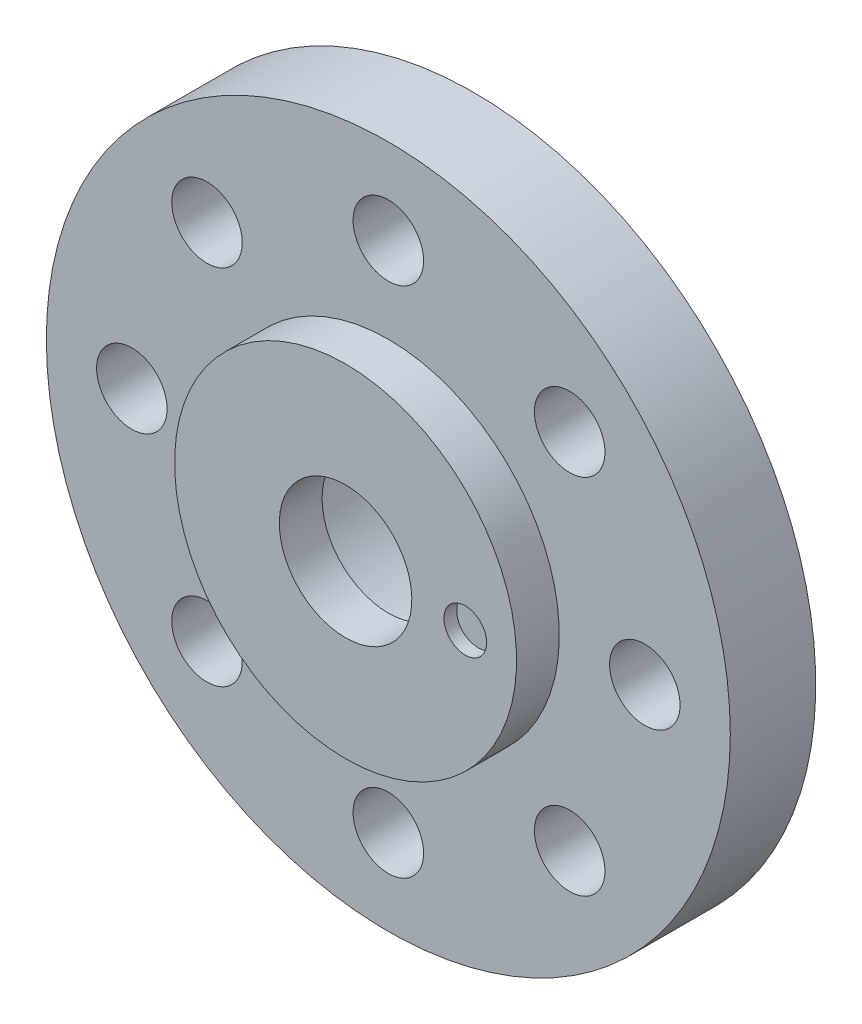
ISO-10303-21;
HEADER;
FILE_DESCRIPTION(('STEP AP214'),'2;1');
FILE_NAME('part.step','',(''),(''),'','','');
FILE_SCHEMA(('AUTOMOTIVE_DESIGN { 1 0 10303 214 1 1 1 1 }'));
ENDSEC;
DATA;
#1=APPLICATION_CONTEXT('core data for automotive mechanical design processes');
#2=APPLICATION_PROTOCOL_DEFINITION('international standard','automotive_design',2000,#1);
#3=PRODUCT_CONTEXT('',#1,'mechanical');
#4=PRODUCT('Part','Part','',(#3));
#5=PRODUCT_RELATED_PRODUCT_CATEGORY('part','',(#4));
#6=PRODUCT_DEFINITION_FORMATION('','',#4);
#7=PRODUCT_DEFINITION_CONTEXT('part definition',#1,'design');
#8=PRODUCT_DEFINITION('design','',#6,#7);
#9=PRODUCT_DEFINITION_SHAPE('','',#8);
#10=(LENGTH_UNIT() NAMED_UNIT(*) SI_UNIT(.MILLI.,.METRE.));
#11=(NAMED_UNIT(*) PLANE_ANGLE_UNIT() SI_UNIT($,.RADIAN.));
#12=(NAMED_UNIT(*) SI_UNIT($,.STERADIAN.) SOLID_ANGLE_UNIT());
#13=UNCERTAINTY_MEASURE_WITH_UNIT(LENGTH_MEASURE(1.E-05),#10,'distance_accuracy_value','');
#14=(GEOMETRIC_REPRESENTATION_CONTEXT(3) GLOBAL_UNCERTAINTY_ASSIGNED_CONTEXT((#13)) GLOBAL_UNIT_ASSIGNED_CONTEXT((#10,
#11,#12)) REPRESENTATION_CONTEXT('',''));
#15=CARTESIAN_POINT('',(0.,0.,0.));
#16=DIRECTION('',(0.,0.,1.));
#17=DIRECTION('',(1.,0.,0.));
#18=AXIS2_PLACEMENT_3D('',#15,#16,#17);
#19=CARTESIAN_POINT('',(2.175,-0.625,10.7));
#20=DIRECTION('',(0.,0.,1.));
#21=DIRECTION('',(1.,0.,0.));
#22=AXIS2_PLACEMENT_3D('',#19,#20,#21);
#23=PLANE('',#22);
#24=CARTESIAN_POINT('',(2.8,0.,10.7));
#25=DIRECTION('',(0.,0.,1.));
#26=DIRECTION('',(1.,0.,0.));
#27=AXIS2_PLACEMENT_3D('',#24,#25,#26);
#28=CIRCLE('',#27,0.5);
#29=CARTESIAN_POINT('',(3.3,0.,10.7));
#30=VERTEX_POINT('',#29);
#31=EDGE_CURVE('E10',#30,#30,#28,.T.);
#32=ORIENTED_EDGE('',*,*,#31,.T.);
#33=EDGE_LOOP('',(#32));
#34=FACE_BOUND('',#33,.T.);
#35=ADVANCED_FACE('F16',(#34),#23,.T.);
#36=CARTESIAN_POINT('',(2.8,0.,10.82));
#37=DIRECTION('',(0.,0.,1.));
#38=DIRECTION('',(1.,0.,0.));
#39=AXIS2_PLACEMENT_3D('',#36,#37,#38);
#40=CYLINDRICAL_SURFACE('',#39,0.5);
#41=ORIENTED_EDGE('',*,*,#31,.F.);
#42=EDGE_LOOP('',(#41));
#43=FACE_BOUND('',#42,.T.);
#44=CARTESIAN_POINT('',(2.8,0.,11.));
#45=DIRECTION('',(0.,0.,-1.));
#46=DIRECTION('',(1.,0.,0.));
#47=AXIS2_PLACEMENT_3D('',#44,#45,#46);
#48=CIRCLE('',#47,0.5);
#49=CARTESIAN_POINT('',(3.3,0.,11.));
#50=VERTEX_POINT('',#49);
#51=EDGE_CURVE('E168',#50,#50,#48,.T.);
#52=ORIENTED_EDGE('',*,*,#51,.F.);
#53=EDGE_LOOP('',(#52));
#54=FACE_BOUND('',#53,.T.);
#55=ADVANCED_FACE('F244',(#43,#54),#40,.F.);
#56=CARTESIAN_POINT('',(0.,0.,7.04));
#57=DIRECTION('',(0.,0.,1.));
#58=DIRECTION('',(1.,0.,0.));
#59=AXIS2_PLACEMENT_3D('',#56,#57,#58);
#60=CYLINDRICAL_SURFACE('',#59,4.5);
#61=CARTESIAN_POINT('',(0.,0.,6.8));
#62=DIRECTION('',(0.,0.,1.));
#63=DIRECTION('',(1.,0.,0.));
#64=AXIS2_PLACEMENT_3D('',#61,#62,#63);
#65=CIRCLE('',#64,4.5);
#66=CARTESIAN_POINT('',(4.5,0.,6.8));
#67=VERTEX_POINT('',#66);
#68=EDGE_CURVE('E199',#67,#67,#65,.T.);
#69=ORIENTED_EDGE('',*,*,#68,.T.);
#70=EDGE_LOOP('',(#69));
#71=FACE_BOUND('',#70,.T.);
#72=CARTESIAN_POINT('',(0.,0.,8.));
#73=DIRECTION('',(0.,0.,-1.));
#74=DIRECTION('',(-1.,0.,0.));
#75=AXIS2_PLACEMENT_3D('',#72,#73,#74);
#76=CIRCLE('',#75,4.5);
#77=CARTESIAN_POINT('',(-4.5,0.,8.));
#78=VERTEX_POINT('',#77);
#79=EDGE_CURVE('E26',#78,#78,#76,.T.);
#80=ORIENTED_EDGE('',*,*,#79,.T.);
#81=EDGE_LOOP('',(#80));
#82=FACE_BOUND('',#81,.T.);
#83=ADVANCED_FACE('F249',(#71,#82),#60,.T.);
#84=CARTESIAN_POINT('',(-11.2051849924017,10.026423563649,8.));
#85=DIRECTION('',(0.,0.,-1.));
#86=DIRECTION('',(0.,-1.,0.));
#87=AXIS2_PLACEMENT_3D('',#84,#85,#86);
#88=PLANE('',#87);
#89=ORIENTED_EDGE('',*,*,#79,.F.);
#90=EDGE_LOOP('',(#89));
#91=FACE_BOUND('',#90,.T.);
#92=CARTESIAN_POINT('',(0.,-6.,8.));
#93=DIRECTION('',(0.,0.,1.));
#94=DIRECTION('',(0.,1.,0.));
#95=AXIS2_PLACEMENT_3D('',#92,#93,#94);
#96=CIRCLE('',#95,0.825);
#97=CARTESIAN_POINT('',(0.,-5.175,8.));
#98=VERTEX_POINT('',#97);
#99=EDGE_CURVE('E195',#98,#98,#96,.T.);
#100=ORIENTED_EDGE('',*,*,#99,.T.);
#101=EDGE_LOOP('',(#100));
#102=FACE_BOUND('',#101,.T.);
#103=CARTESIAN_POINT('',(4.24264068711929,-4.24264068711928,8.));
#104=DIRECTION('',(0.,0.,1.));
#105=DIRECTION('',(0.,1.,0.));
#106=AXIS2_PLACEMENT_3D('',#103,#104,#105);
#107=CIRCLE('',#106,0.825);
#108=CARTESIAN_POINT('',(4.24264068711929,-3.41764068711928,8.));
#109=VERTEX_POINT('',#108);
#110=EDGE_CURVE('E192',#109,#109,#107,.T.);
#111=ORIENTED_EDGE('',*,*,#110,.T.);
#112=EDGE_LOOP('',(#111));
#113=FACE_BOUND('',#112,.T.);
#114=CARTESIAN_POINT('',(6.,0.,8.));
#115=DIRECTION('',(0.,0.,1.));
#116=DIRECTION('',(0.,1.,0.));
#117=AXIS2_PLACEMENT_3D('',#114,#115,#116);
#118=CIRCLE('',#117,0.825);
#119=CARTESIAN_POINT('',(6.,0.825000000000021,8.));
#120=VERTEX_POINT('',#119);
#121=EDGE_CURVE('E196',#120,#120,#118,.T.);
#122=ORIENTED_EDGE('',*,*,#121,.T.);
#123=EDGE_LOOP('',(#122));
#124=FACE_BOUND('',#123,.T.);
#125=CARTESIAN_POINT('',(4.24264068711926,4.24264068711931,8.));
#126=DIRECTION('',(0.,0.,1.));
#127=DIRECTION('',(0.,1.,0.));
#128=AXIS2_PLACEMENT_3D('',#125,#126,#127);
#129=CIRCLE('',#128,0.825);
#130=CARTESIAN_POINT('',(4.24264068711926,5.06764068711931,8.));
#131=VERTEX_POINT('',#130);
#132=EDGE_CURVE('E209',#131,#131,#129,.T.);
#133=ORIENTED_EDGE('',*,*,#132,.T.);
#134=EDGE_LOOP('',(#133));
#135=FACE_BOUND('',#134,.T.);
#136=CARTESIAN_POINT('',(0.,6.,8.));
#137=DIRECTION('',(0.,0.,1.));
#138=DIRECTION('',(0.,1.,0.));
#139=AXIS2_PLACEMENT_3D('',#136,#137,#138);
#140=CIRCLE('',#139,0.825);
#141=CARTESIAN_POINT('',(0.,6.825,8.));
#142=VERTEX_POINT('',#141);
#143=EDGE_CURVE('E160',#142,#142,#140,.T.);
#144=ORIENTED_EDGE('',*,*,#143,.T.);
#145=EDGE_LOOP('',(#144));
#146=FACE_BOUND('',#145,.T.);
#147=CARTESIAN_POINT('',(-4.24264068711931,4.24264068711925,8.));
#148=DIRECTION('',(0.,0.,1.));
#149=DIRECTION('',(0.,1.,0.));
#150=AXIS2_PLACEMENT_3D('',#147,#148,#149);
#151=CIRCLE('',#150,0.825);
#152=CARTESIAN_POINT('',(-4.24264068711932,5.06764068711925,8.));
#153=VERTEX_POINT('',#152);
#154=EDGE_CURVE('E152',#153,#153,#151,.T.);
#155=ORIENTED_EDGE('',*,*,#154,.T.);
#156=EDGE_LOOP('',(#155));
#157=FACE_BOUND('',#156,.T.);
#158=CARTESIAN_POINT('',(-6.,0.,8.));
#159=DIRECTION('',(0.,0.,1.));
#160=DIRECTION('',(0.,1.,0.));
#161=AXIS2_PLACEMENT_3D('',#158,#159,#160);
#162=CIRCLE('',#161,0.825);
#163=CARTESIAN_POINT('',(-6.,0.824999999999936,8.));
#164=VERTEX_POINT('',#163);
#165=EDGE_CURVE('E147',#164,#164,#162,.T.);
#166=ORIENTED_EDGE('',*,*,#165,.T.);
#167=EDGE_LOOP('',(#166));
#168=FACE_BOUND('',#167,.T.);
#169=CARTESIAN_POINT('',(-4.24264068711923,-4.24264068711934,8.));
#170=DIRECTION('',(0.,0.,1.));
#171=DIRECTION('',(0.,1.,0.));
#172=AXIS2_PLACEMENT_3D('',#169,#170,#171);
#173=CIRCLE('',#172,0.825);
#174=CARTESIAN_POINT('',(-4.24264068711923,-3.41764068711934,8.));
#175=VERTEX_POINT('',#174);
#176=EDGE_CURVE('E153',#175,#175,#173,.T.);
#177=ORIENTED_EDGE('',*,*,#176,.T.);
#178=EDGE_LOOP('',(#177));
#179=FACE_BOUND('',#178,.T.);
#180=CARTESIAN_POINT('',(2.690741E-12,8.586008E-13,8.));
#181=DIRECTION('',(0.,0.,-1.));
#182=DIRECTION('',(-0.819152044289053,-0.573576436350958,0.));
#183=AXIS2_PLACEMENT_3D('',#180,#181,#182);
#184=CIRCLE('',#183,8.00000000000269);
#185=CARTESIAN_POINT('',(-6.55321635431194,-4.58861149080835,8.));
#186=VERTEX_POINT('',#185);
#187=EDGE_CURVE('E204',#186,#186,#184,.T.);
#188=ORIENTED_EDGE('',*,*,#187,.T.);
#189=EDGE_LOOP('',(#188));
#190=FACE_BOUND('',#189,.T.);
#191=ADVANCED_FACE('F148',(#91,#102,#113,#124,#135,#146,#157,#168,#179,#190),#88,.T.);
#192=CARTESIAN_POINT('',(0.,-6.,8.28));
#193=DIRECTION('',(0.,0.,1.));
#194=DIRECTION('',(1.,0.,0.));
#195=AXIS2_PLACEMENT_3D('',#192,#193,#194);
#196=CYLINDRICAL_SURFACE('',#195,0.825);
#197=CARTESIAN_POINT('',(0.,-6.,10.));
#198=DIRECTION('',(0.,0.,-1.));
#199=DIRECTION('',(0.,-1.,0.));
#200=AXIS2_PLACEMENT_3D('',#197,#198,#199);
#201=CIRCLE('',#200,0.825);
#202=CARTESIAN_POINT('',(0.,-6.825,10.));
#203=VERTEX_POINT('',#202);
#204=EDGE_CURVE('E181',#203,#203,#201,.T.);
#205=ORIENTED_EDGE('',*,*,#204,.F.);
#206=EDGE_LOOP('',(#205));
#207=FACE_BOUND('',#206,.T.);
#208=ORIENTED_EDGE('',*,*,#99,.F.);
#209=EDGE_LOOP('',(#208));
#210=FACE_BOUND('',#209,.T.);
#211=ADVANCED_FACE('F254',(#207,#210),#196,.F.);
#212=CARTESIAN_POINT('',(4.24264068711929,-4.24264068711928,8.28));
#213=DIRECTION('',(0.,0.,1.));
#214=DIRECTION('',(1.,0.,0.));
#215=AXIS2_PLACEMENT_3D('',#212,#213,#214);
#216=CYLINDRICAL_SURFACE('',#215,0.825);
#217=CARTESIAN_POINT('',(4.24264068711927,-4.24264068711927,10.));
#218=DIRECTION('',(0.,0.,-1.));
#219=DIRECTION('',(0.,-1.,0.));
#220=AXIS2_PLACEMENT_3D('',#217,#218,#219);
#221=CIRCLE('',#220,0.825);
#222=CARTESIAN_POINT('',(4.24264068711929,-5.06764068711928,10.));
#223=VERTEX_POINT('',#222);
#224=EDGE_CURVE('E184',#223,#223,#221,.T.);
#225=ORIENTED_EDGE('',*,*,#224,.F.);
#226=EDGE_LOOP('',(#225));
#227=FACE_BOUND('',#226,.T.);
#228=ORIENTED_EDGE('',*,*,#110,.F.);
#229=EDGE_LOOP('',(#228));
#230=FACE_BOUND('',#229,.T.);
#231=ADVANCED_FACE('F287',(#227,#230),#216,.F.);
#232=CARTESIAN_POINT('',(6.,0.,8.28));
#233=DIRECTION('',(0.,0.,1.));
#234=DIRECTION('',(1.,0.,0.));
#235=AXIS2_PLACEMENT_3D('',#232,#233,#234);
#236=CYLINDRICAL_SURFACE('',#235,0.825);
#237=CARTESIAN_POINT('',(6.,0.,10.));
#238=DIRECTION('',(0.,0.,-1.));
#239=DIRECTION('',(0.,-1.,0.));
#240=AXIS2_PLACEMENT_3D('',#237,#238,#239);
#241=CIRCLE('',#240,0.825);
#242=CARTESIAN_POINT('',(6.,-0.824999999999978,10.));
#243=VERTEX_POINT('',#242);
#244=EDGE_CURVE('E187',#243,#243,#241,.T.);
#245=ORIENTED_EDGE('',*,*,#244,.F.);
#246=EDGE_LOOP('',(#245));
#247=FACE_BOUND('',#246,.T.);
#248=ORIENTED_EDGE('',*,*,#121,.F.);
#249=EDGE_LOOP('',(#248));
#250=FACE_BOUND('',#249,.T.);
#251=ADVANCED_FACE('F283',(#247,#250),#236,.F.);
#252=CARTESIAN_POINT('',(4.24264068711926,4.24264068711931,8.28));
#253=DIRECTION('',(0.,0.,1.));
#254=DIRECTION('',(1.,0.,0.));
#255=AXIS2_PLACEMENT_3D('',#252,#253,#254);
#256=CYLINDRICAL_SURFACE('',#255,0.825);
#257=CARTESIAN_POINT('',(4.24264068711924,4.24264068711931,10.));
#258=DIRECTION('',(0.,0.,-1.));
#259=DIRECTION('',(0.,-1.,0.));
#260=AXIS2_PLACEMENT_3D('',#257,#258,#259);
#261=CIRCLE('',#260,0.825);
#262=CARTESIAN_POINT('',(4.24264068711926,3.41764068711931,10.));
#263=VERTEX_POINT('',#262);
#264=EDGE_CURVE('E188',#263,#263,#261,.T.);
#265=ORIENTED_EDGE('',*,*,#264,.F.);
#266=EDGE_LOOP('',(#265));
#267=FACE_BOUND('',#266,.T.);
#268=ORIENTED_EDGE('',*,*,#132,.F.);
#269=EDGE_LOOP('',(#268));
#270=FACE_BOUND('',#269,.T.);
#271=ADVANCED_FACE('F286',(#267,#270),#256,.F.);
#272=CARTESIAN_POINT('',(0.,6.,8.28));
#273=DIRECTION('',(0.,0.,1.));
#274=DIRECTION('',(1.,0.,0.));
#275=AXIS2_PLACEMENT_3D('',#272,#273,#274);
#276=CYLINDRICAL_SURFACE('',#275,0.825);
#277=CARTESIAN_POINT('',(0.,6.,10.));
#278=DIRECTION('',(0.,0.,-1.));
#279=DIRECTION('',(0.,-1.,0.));
#280=AXIS2_PLACEMENT_3D('',#277,#278,#279);
#281=CIRCLE('',#280,0.825);
#282=CARTESIAN_POINT('',(0.,5.175,10.));
#283=VERTEX_POINT('',#282);
#284=EDGE_CURVE('E191',#283,#283,#281,.T.);
#285=ORIENTED_EDGE('',*,*,#284,.F.);
#286=EDGE_LOOP('',(#285));
#287=FACE_BOUND('',#286,.T.);
#288=ORIENTED_EDGE('',*,*,#143,.F.);
#289=EDGE_LOOP('',(#288));
#290=FACE_BOUND('',#289,.T.);
#291=ADVANCED_FACE('F281',(#287,#290),#276,.F.);
#292=CARTESIAN_POINT('',(-4.24264068711932,4.24264068711925,8.28));
#293=DIRECTION('',(0.,0.,1.));
#294=DIRECTION('',(1.,0.,0.));
#295=AXIS2_PLACEMENT_3D('',#292,#293,#294);
#296=CYLINDRICAL_SURFACE('',#295,0.825);
#297=CARTESIAN_POINT('',(-4.24264068711931,4.24264068711924,10.));
#298=DIRECTION('',(0.,0.,-1.));
#299=DIRECTION('',(0.,-1.,0.));
#300=AXIS2_PLACEMENT_3D('',#297,#298,#299);
#301=CIRCLE('',#300,0.825);
#302=CARTESIAN_POINT('',(-4.24264068711932,3.41764068711925,10.));
#303=VERTEX_POINT('',#302);
#304=EDGE_CURVE('E162',#303,#303,#301,.T.);
#305=ORIENTED_EDGE('',*,*,#304,.F.);
#306=EDGE_LOOP('',(#305));
#307=FACE_BOUND('',#306,.T.);
#308=ORIENTED_EDGE('',*,*,#154,.F.);
#309=EDGE_LOOP('',(#308));
#310=FACE_BOUND('',#309,.T.);
#311=ADVANCED_FACE('F278',(#307,#310),#296,.F.);
#312=CARTESIAN_POINT('',(-6.,0.,8.28));
#313=DIRECTION('',(0.,0.,1.));
#314=DIRECTION('',(1.,0.,0.));
#315=AXIS2_PLACEMENT_3D('',#312,#313,#314);
#316=CYLINDRICAL_SURFACE('',#315,0.825);
#317=CARTESIAN_POINT('',(-6.,0.,10.));
#318=DIRECTION('',(0.,0.,-1.));
#319=DIRECTION('',(0.,-1.,0.));
#320=AXIS2_PLACEMENT_3D('',#317,#318,#319);
#321=CIRCLE('',#320,0.825);
#322=CARTESIAN_POINT('',(-6.,-0.825000000000063,10.));
#323=VERTEX_POINT('',#322);
#324=EDGE_CURVE('E177',#323,#323,#321,.T.);
#325=ORIENTED_EDGE('',*,*,#324,.F.);
#326=EDGE_LOOP('',(#325));
#327=FACE_BOUND('',#326,.T.);
#328=ORIENTED_EDGE('',*,*,#165,.F.);
#329=EDGE_LOOP('',(#328));
#330=FACE_BOUND('',#329,.T.);
#331=ADVANCED_FACE('F237',(#327,#330),#316,.F.);
#332=CARTESIAN_POINT('',(-4.24264068711923,-4.24264068711934,8.28));
#333=DIRECTION('',(0.,0.,1.));
#334=DIRECTION('',(1.,0.,0.));
#335=AXIS2_PLACEMENT_3D('',#332,#333,#334);
#336=CYLINDRICAL_SURFACE('',#335,0.825);
#337=CARTESIAN_POINT('',(-4.24264068711921,-4.24264068711933,10.));
#338=DIRECTION('',(0.,0.,-1.));
#339=DIRECTION('',(0.,-1.,0.));
#340=AXIS2_PLACEMENT_3D('',#337,#338,#339);
#341=CIRCLE('',#340,0.825);
#342=CARTESIAN_POINT('',(-4.24264068711923,-5.06764068711934,10.));
#343=VERTEX_POINT('',#342);
#344=EDGE_CURVE('E166',#343,#343,#341,.T.);
#345=ORIENTED_EDGE('',*,*,#344,.F.);
#346=EDGE_LOOP('',(#345));
#347=FACE_BOUND('',#346,.T.);
#348=ORIENTED_EDGE('',*,*,#176,.F.);
#349=EDGE_LOOP('',(#348));
#350=FACE_BOUND('',#349,.T.);
#351=ADVANCED_FACE('F228',(#347,#350),#336,.F.);
#352=CARTESIAN_POINT('',(-8.800000000007,-8.8,10.));
#353=DIRECTION('',(0.,0.,1.));
#354=DIRECTION('',(1.,0.,0.));
#355=AXIS2_PLACEMENT_3D('',#352,#353,#354);
#356=PLANE('',#355);
#357=CARTESIAN_POINT('',(0.,0.,10.));
#358=DIRECTION('',(0.,0.,1.));
#359=DIRECTION('',(0.,-1.,0.));
#360=AXIS2_PLACEMENT_3D('',#357,#358,#359);
#361=CIRCLE('',#360,4.);
#362=CARTESIAN_POINT('',(0.,-4.,10.));
#363=VERTEX_POINT('',#362);
#364=EDGE_CURVE('E116',#363,#363,#361,.T.);
#365=ORIENTED_EDGE('',*,*,#364,.F.);
#366=EDGE_LOOP('',(#365));
#367=FACE_BOUND('',#366,.T.);
#368=ORIENTED_EDGE('',*,*,#304,.T.);
#369=EDGE_LOOP('',(#368));
#370=FACE_BOUND('',#369,.T.);
#371=ORIENTED_EDGE('',*,*,#284,.T.);
#372=EDGE_LOOP('',(#371));
#373=FACE_BOUND('',#372,.T.);
#374=ORIENTED_EDGE('',*,*,#264,.T.);
#375=EDGE_LOOP('',(#374));
#376=FACE_BOUND('',#375,.T.);
#377=ORIENTED_EDGE('',*,*,#244,.T.);
#378=EDGE_LOOP('',(#377));
#379=FACE_BOUND('',#378,.T.);
#380=ORIENTED_EDGE('',*,*,#224,.T.);
#381=EDGE_LOOP('',(#380));
#382=FACE_BOUND('',#381,.T.);
#383=ORIENTED_EDGE('',*,*,#204,.T.);
#384=EDGE_LOOP('',(#383));
#385=FACE_BOUND('',#384,.T.);
#386=ORIENTED_EDGE('',*,*,#344,.T.);
#387=EDGE_LOOP('',(#386));
#388=FACE_BOUND('',#387,.T.);
#389=ORIENTED_EDGE('',*,*,#324,.T.);
#390=EDGE_LOOP('',(#389));
#391=FACE_BOUND('',#390,.T.);
#392=CARTESIAN_POINT('',(-7.001127E-12,0.,10.));
#393=DIRECTION('',(0.,0.,-1.));
#394=DIRECTION('',(1.,0.,0.));
#395=AXIS2_PLACEMENT_3D('',#392,#393,#394);
#396=CIRCLE('',#395,8.);
#397=CARTESIAN_POINT('',(7.999999999993,0.,10.));
#398=VERTEX_POINT('',#397);
#399=EDGE_CURVE('E180',#398,#398,#396,.T.);
#400=ORIENTED_EDGE('',*,*,#399,.F.);
#401=EDGE_LOOP('',(#400));
#402=FACE_BOUND('',#401,.T.);
#403=ADVANCED_FACE('F226',(#367,#370,#373,#376,#379,#382,#385,#388,#391,#402),#356,.T.);
#404=CARTESIAN_POINT('',(-7.003946E-12,0.,9.6));
#405=DIRECTION('',(0.,0.,-1.));
#406=DIRECTION('',(-1.,0.,0.));
#407=AXIS2_PLACEMENT_3D('',#404,#405,#406);
#408=CYLINDRICAL_SURFACE('',#407,8.);
#409=ORIENTED_EDGE('',*,*,#399,.T.);
#410=EDGE_LOOP('',(#409));
#411=FACE_BOUND('',#410,.T.);
#412=ORIENTED_EDGE('',*,*,#187,.F.);
#413=EDGE_LOOP('',(#412));
#414=FACE_BOUND('',#413,.T.);
#415=ADVANCED_FACE('F223',(#411,#414),#408,.T.);
#416=CARTESIAN_POINT('',(-3.3,3.3,10.));
#417=DIRECTION('',(0.,0.,-1.));
#418=DIRECTION('',(0.,-1.,0.));
#419=AXIS2_PLACEMENT_3D('',#416,#417,#418);
#420=PLANE('',#419);
#421=CARTESIAN_POINT('',(0.,0.,10.));
#422=DIRECTION('',(0.,0.,1.));
#423=DIRECTION('',(0.,1.,0.));
#424=AXIS2_PLACEMENT_3D('',#421,#422,#423);
#425=CIRCLE('',#424,1.55);
#426=CARTESIAN_POINT('',(0.,1.55,10.));
#427=VERTEX_POINT('',#426);
#428=EDGE_CURVE('E308',#427,#427,#425,.T.);
#429=ORIENTED_EDGE('',*,*,#428,.T.);
#430=EDGE_LOOP('',(#429));
#431=FACE_BOUND('',#430,.T.);
#432=CARTESIAN_POINT('',(0.,0.,10.));
#433=DIRECTION('',(0.,0.,1.));
#434=DIRECTION('',(1.,0.,0.));
#435=AXIS2_PLACEMENT_3D('',#432,#433,#434);
#436=CIRCLE('',#435,3.);
#437=CARTESIAN_POINT('',(3.,0.,10.));
#438=VERTEX_POINT('',#437);
#439=EDGE_CURVE('E172',#438,#438,#436,.T.);
#440=ORIENTED_EDGE('',*,*,#439,.F.);
#441=EDGE_LOOP('',(#440));
#442=FACE_BOUND('',#441,.T.);
#443=ADVANCED_FACE('F18',(#431,#442),#420,.T.);
#444=CARTESIAN_POINT('',(0.,0.,4.88));
#445=DIRECTION('',(0.,0.,-1.));
#446=DIRECTION('',(-1.,0.,0.));
#447=AXIS2_PLACEMENT_3D('',#444,#445,#446);
#448=CYLINDRICAL_SURFACE('',#447,3.);
#449=CARTESIAN_POINT('',(0.,0.,6.8));
#450=DIRECTION('',(0.,0.,-1.));
#451=DIRECTION('',(1.,0.,0.));
#452=AXIS2_PLACEMENT_3D('',#449,#450,#451);
#453=CIRCLE('',#452,3.);
#454=CARTESIAN_POINT('',(3.,0.,6.8));
#455=VERTEX_POINT('',#454);
#456=EDGE_CURVE('E173',#455,#455,#453,.T.);
#457=ORIENTED_EDGE('',*,*,#456,.T.);
#458=EDGE_LOOP('',(#457));
#459=FACE_BOUND('',#458,.T.);
#460=ORIENTED_EDGE('',*,*,#439,.T.);
#461=EDGE_LOOP('',(#460));
#462=FACE_BOUND('',#461,.T.);
#463=ADVANCED_FACE('F259',(#459,#462),#448,.F.);
#464=CARTESIAN_POINT('',(-4.4,-4.4,11.));
#465=DIRECTION('',(0.,0.,1.));
#466=DIRECTION('',(1.,0.,0.));
#467=AXIS2_PLACEMENT_3D('',#464,#465,#466);
#468=PLANE('',#467);
#469=ORIENTED_EDGE('',*,*,#51,.T.);
#470=EDGE_LOOP('',(#469));
#471=FACE_BOUND('',#470,.T.);
#472=CARTESIAN_POINT('',(0.,0.,11.));
#473=DIRECTION('',(0.,0.,-1.));
#474=DIRECTION('',(0.,-1.,0.));
#475=AXIS2_PLACEMENT_3D('',#472,#473,#474);
#476=CIRCLE('',#475,1.55);
#477=CARTESIAN_POINT('',(0.,-1.55,11.));
#478=VERTEX_POINT('',#477);
#479=EDGE_CURVE('E175',#478,#478,#476,.T.);
#480=ORIENTED_EDGE('',*,*,#479,.T.);
#481=EDGE_LOOP('',(#480));
#482=FACE_BOUND('',#481,.T.);
#483=CARTESIAN_POINT('',(0.,0.,11.));
#484=DIRECTION('',(0.,0.,-1.));
#485=DIRECTION('',(0.,1.,0.));
#486=AXIS2_PLACEMENT_3D('',#483,#484,#485);
#487=CIRCLE('',#486,4.);
#488=CARTESIAN_POINT('',(0.,4.,11.));
#489=VERTEX_POINT('',#488);
#490=EDGE_CURVE('E127',#489,#489,#487,.T.);
#491=ORIENTED_EDGE('',*,*,#490,.F.);
#492=EDGE_LOOP('',(#491));
#493=FACE_BOUND('',#492,.T.);
#494=ADVANCED_FACE('F256',(#471,#482,#493),#468,.T.);
#495=CARTESIAN_POINT('',(-4.95,4.95,6.8));
#496=DIRECTION('',(0.,0.,-1.));
#497=DIRECTION('',(0.,-1.,0.));
#498=AXIS2_PLACEMENT_3D('',#495,#496,#497);
#499=PLANE('',#498);
#500=ORIENTED_EDGE('',*,*,#456,.F.);
#501=EDGE_LOOP('',(#500));
#502=FACE_BOUND('',#501,.T.);
#503=ORIENTED_EDGE('',*,*,#68,.F.);
#504=EDGE_LOOP('',(#503));
#505=FACE_BOUND('',#504,.T.);
#506=ADVANCED_FACE('F258',(#502,#505),#499,.T.);
#507=CARTESIAN_POINT('',(0.,0.,10.86));
#508=DIRECTION('',(0.,0.,-1.));
#509=DIRECTION('',(-1.,0.,0.));
#510=AXIS2_PLACEMENT_3D('',#507,#508,#509);
#511=CYLINDRICAL_SURFACE('',#510,4.);
#512=ORIENTED_EDGE('',*,*,#364,.T.);
#513=EDGE_LOOP('',(#512));
#514=FACE_BOUND('',#513,.T.);
#515=ORIENTED_EDGE('',*,*,#490,.T.);
#516=EDGE_LOOP('',(#515));
#517=FACE_BOUND('',#516,.T.);
#518=ADVANCED_FACE('F264',(#514,#517),#511,.T.);
#519=CARTESIAN_POINT('',(0.,0.,10.14));
#520=DIRECTION('',(0.,0.,1.));
#521=DIRECTION('',(1.,0.,0.));
#522=AXIS2_PLACEMENT_3D('',#519,#520,#521);
#523=CYLINDRICAL_SURFACE('',#522,1.55);
#524=ORIENTED_EDGE('',*,*,#479,.F.);
#525=EDGE_LOOP('',(#524));
#526=FACE_BOUND('',#525,.T.);
#527=ORIENTED_EDGE('',*,*,#428,.F.);
#528=EDGE_LOOP('',(#527));
#529=FACE_BOUND('',#528,.T.);
#530=ADVANCED_FACE('F262',(#526,#529),#523,.F.);
#531=CLOSED_SHELL('',(#35,#55,#83,#191,#211,#231,#251,#271,#291,#311,#331,#351,#403,#415,#443,
#463,#494,#506,#518,#530));
#532=MANIFOLD_SOLID_BREP('B1',#531);
#533=ADVANCED_BREP_SHAPE_REPRESENTATION('',(#18,#532),#14);
#534=SHAPE_DEFINITION_REPRESENTATION(#9,#533);
ENDSEC;
END-ISO-10303-21;
